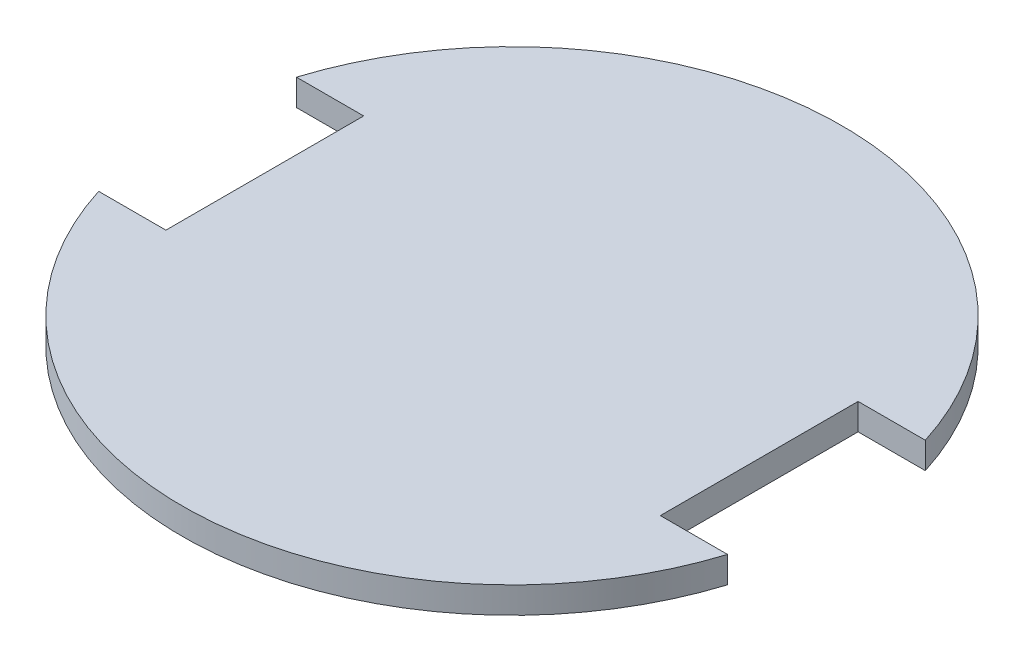
ISO-10303-21;
HEADER;
FILE_DESCRIPTION(('STEP AP214'),'2;1');
FILE_NAME('part.step','',(''),(''),'','','');
FILE_SCHEMA(('AUTOMOTIVE_DESIGN { 1 0 10303 214 1 1 1 1 }'));
ENDSEC;
DATA;
#1=APPLICATION_CONTEXT('core data for automotive mechanical design processes');
#2=APPLICATION_PROTOCOL_DEFINITION('international standard','automotive_design',2000,#1);
#3=PRODUCT_CONTEXT('',#1,'mechanical');
#4=PRODUCT('Part','Part','',(#3));
#5=PRODUCT_RELATED_PRODUCT_CATEGORY('part','',(#4));
#6=PRODUCT_DEFINITION_FORMATION('','',#4);
#7=PRODUCT_DEFINITION_CONTEXT('part definition',#1,'design');
#8=PRODUCT_DEFINITION('design','',#6,#7);
#9=PRODUCT_DEFINITION_SHAPE('','',#8);
#10=(LENGTH_UNIT() NAMED_UNIT(*) SI_UNIT(.MILLI.,.METRE.));
#11=(NAMED_UNIT(*) PLANE_ANGLE_UNIT() SI_UNIT($,.RADIAN.));
#12=(NAMED_UNIT(*) SI_UNIT($,.STERADIAN.) SOLID_ANGLE_UNIT());
#13=UNCERTAINTY_MEASURE_WITH_UNIT(LENGTH_MEASURE(1.E-05),#10,'distance_accuracy_value','');
#14=(GEOMETRIC_REPRESENTATION_CONTEXT(3) GLOBAL_UNCERTAINTY_ASSIGNED_CONTEXT((#13)) GLOBAL_UNIT_ASSIGNED_CONTEXT((#10,
#11,#12)) REPRESENTATION_CONTEXT('',''));
#15=CARTESIAN_POINT('',(0.,0.,0.));
#16=DIRECTION('',(0.,0.,1.));
#17=DIRECTION('',(1.,0.,0.));
#18=AXIS2_PLACEMENT_3D('',#15,#16,#17);
#19=CARTESIAN_POINT('',(-75.,8.,-30.));
#20=DIRECTION('',(0.,0.,-1.));
#21=DIRECTION('',(-1.,0.,0.));
#22=AXIS2_PLACEMENT_3D('',#19,#20,#21);
#23=PLANE('',#22);
#24=DIRECTION('',(1.,0.,0.));
#25=VECTOR('',#24,1.);
#26=CARTESIAN_POINT('',(-75.,0.,-30.));
#27=LINE('',#26,#25);
#28=CARTESIAN_POINT('',(-95.3939201416946,0.,-30.));
#29=VERTEX_POINT('',#28);
#30=CARTESIAN_POINT('',(-75.,0.,-30.));
#31=VERTEX_POINT('',#30);
#32=EDGE_CURVE('E212',#29,#31,#27,.T.);
#33=ORIENTED_EDGE('',*,*,#32,.T.);
#34=DIRECTION('',(0.,-1.,0.));
#35=VECTOR('',#34,1.);
#36=CARTESIAN_POINT('',(-75.,8.,-30.));
#37=LINE('',#36,#35);
#38=CARTESIAN_POINT('',(-75.,8.,-30.));
#39=VERTEX_POINT('',#38);
#40=EDGE_CURVE('E12',#39,#31,#37,.T.);
#41=ORIENTED_EDGE('',*,*,#40,.F.);
#42=DIRECTION('',(1.,0.,0.));
#43=VECTOR('',#42,1.);
#44=CARTESIAN_POINT('',(-75.,8.,-30.));
#45=LINE('',#44,#43);
#46=CARTESIAN_POINT('',(-95.3939201416946,8.,-30.));
#47=VERTEX_POINT('',#46);
#48=EDGE_CURVE('E164',#47,#39,#45,.T.);
#49=ORIENTED_EDGE('',*,*,#48,.F.);
#50=DIRECTION('',(0.,-1.,0.));
#51=VECTOR('',#50,1.);
#52=CARTESIAN_POINT('',(-95.3939201416946,8.,-30.));
#53=LINE('',#52,#51);
#54=EDGE_CURVE('E139',#47,#29,#53,.T.);
#55=ORIENTED_EDGE('',*,*,#54,.T.);
#56=EDGE_LOOP('',(#33,#41,#49,#55));
#57=FACE_BOUND('',#56,.T.);
#58=ADVANCED_FACE('F41',(#57),#23,.F.);
#59=CARTESIAN_POINT('',(-75.,8.,-30.));
#60=DIRECTION('',(1.,0.,0.));
#61=DIRECTION('',(0.,0.,-1.));
#62=AXIS2_PLACEMENT_3D('',#59,#60,#61);
#63=PLANE('',#62);
#64=DIRECTION('',(0.,0.,1.));
#65=VECTOR('',#64,1.);
#66=CARTESIAN_POINT('',(-75.,0.,-30.));
#67=LINE('',#66,#65);
#68=CARTESIAN_POINT('',(-75.,0.,30.));
#69=VERTEX_POINT('',#68);
#70=EDGE_CURVE('E205',#31,#69,#67,.T.);
#71=ORIENTED_EDGE('',*,*,#70,.T.);
#72=DIRECTION('',(0.,-1.,0.));
#73=VECTOR('',#72,1.);
#74=CARTESIAN_POINT('',(-75.,8.,30.));
#75=LINE('',#74,#73);
#76=CARTESIAN_POINT('',(-75.,8.,30.));
#77=VERTEX_POINT('',#76);
#78=EDGE_CURVE('E50',#77,#69,#75,.T.);
#79=ORIENTED_EDGE('',*,*,#78,.F.);
#80=DIRECTION('',(0.,0.,1.));
#81=VECTOR('',#80,1.);
#82=CARTESIAN_POINT('',(-75.,8.,-30.));
#83=LINE('',#82,#81);
#84=EDGE_CURVE('E101',#39,#77,#83,.T.);
#85=ORIENTED_EDGE('',*,*,#84,.F.);
#86=ORIENTED_EDGE('',*,*,#40,.T.);
#87=EDGE_LOOP('',(#71,#79,#85,#86));
#88=FACE_BOUND('',#87,.T.);
#89=ADVANCED_FACE('F238',(#88),#63,.F.);
#90=CARTESIAN_POINT('',(-75.,8.,30.));
#91=DIRECTION('',(0.,0.,1.));
#92=DIRECTION('',(1.,0.,0.));
#93=AXIS2_PLACEMENT_3D('',#90,#91,#92);
#94=PLANE('',#93);
#95=DIRECTION('',(-1.,0.,0.));
#96=VECTOR('',#95,1.);
#97=CARTESIAN_POINT('',(-75.,0.,30.));
#98=LINE('',#97,#96);
#99=CARTESIAN_POINT('',(-95.3939201416946,0.,30.));
#100=VERTEX_POINT('',#99);
#101=EDGE_CURVE('E200',#69,#100,#98,.T.);
#102=ORIENTED_EDGE('',*,*,#101,.T.);
#103=DIRECTION('',(0.,-1.,0.));
#104=VECTOR('',#103,1.);
#105=CARTESIAN_POINT('',(-95.3939201416946,8.,30.));
#106=LINE('',#105,#104);
#107=CARTESIAN_POINT('',(-95.3939201416946,8.,30.));
#108=VERTEX_POINT('',#107);
#109=EDGE_CURVE('E188',#108,#100,#106,.T.);
#110=ORIENTED_EDGE('',*,*,#109,.F.);
#111=DIRECTION('',(-1.,0.,0.));
#112=VECTOR('',#111,1.);
#113=CARTESIAN_POINT('',(-75.,8.,30.));
#114=LINE('',#113,#112);
#115=EDGE_CURVE('E156',#77,#108,#114,.T.);
#116=ORIENTED_EDGE('',*,*,#115,.F.);
#117=ORIENTED_EDGE('',*,*,#78,.T.);
#118=EDGE_LOOP('',(#102,#110,#116,#117));
#119=FACE_BOUND('',#118,.T.);
#120=ADVANCED_FACE('F198',(#119),#94,.F.);
#121=CARTESIAN_POINT('',(0.,8.,0.));
#122=DIRECTION('',(0.,-1.,0.));
#123=DIRECTION('',(0.,0.,-1.));
#124=AXIS2_PLACEMENT_3D('',#121,#122,#123);
#125=CYLINDRICAL_SURFACE('',#124,100.);
#126=CARTESIAN_POINT('',(0.,0.,0.));
#127=DIRECTION('',(0.,1.,0.));
#128=DIRECTION('',(0.,0.,-1.));
#129=AXIS2_PLACEMENT_3D('',#126,#127,#128);
#130=CIRCLE('',#129,100.);
#131=CARTESIAN_POINT('',(95.3939201416946,0.,30.));
#132=VERTEX_POINT('',#131);
#133=EDGE_CURVE('E207',#100,#132,#130,.T.);
#134=ORIENTED_EDGE('',*,*,#133,.T.);
#135=DIRECTION('',(0.,-1.,0.));
#136=VECTOR('',#135,1.);
#137=CARTESIAN_POINT('',(95.3939201416946,8.,30.));
#138=LINE('',#137,#136);
#139=CARTESIAN_POINT('',(95.3939201416946,8.,30.));
#140=VERTEX_POINT('',#139);
#141=EDGE_CURVE('E184',#140,#132,#138,.T.);
#142=ORIENTED_EDGE('',*,*,#141,.F.);
#143=CARTESIAN_POINT('',(0.,8.,0.));
#144=DIRECTION('',(0.,1.,0.));
#145=DIRECTION('',(0.,0.,-1.));
#146=AXIS2_PLACEMENT_3D('',#143,#144,#145);
#147=CIRCLE('',#146,100.);
#148=EDGE_CURVE('E152',#108,#140,#147,.T.);
#149=ORIENTED_EDGE('',*,*,#148,.F.);
#150=ORIENTED_EDGE('',*,*,#109,.T.);
#151=EDGE_LOOP('',(#134,#142,#149,#150));
#152=FACE_BOUND('',#151,.T.);
#153=ADVANCED_FACE('F230',(#152),#125,.T.);
#154=CARTESIAN_POINT('',(75.,8.,30.));
#155=DIRECTION('',(0.,0.,1.));
#156=DIRECTION('',(1.,0.,0.));
#157=AXIS2_PLACEMENT_3D('',#154,#155,#156);
#158=PLANE('',#157);
#159=DIRECTION('',(-1.,0.,0.));
#160=VECTOR('',#159,1.);
#161=CARTESIAN_POINT('',(75.,0.,30.));
#162=LINE('',#161,#160);
#163=CARTESIAN_POINT('',(75.,0.,30.));
#164=VERTEX_POINT('',#163);
#165=EDGE_CURVE('E209',#132,#164,#162,.T.);
#166=ORIENTED_EDGE('',*,*,#165,.T.);
#167=DIRECTION('',(0.,-1.,0.));
#168=VECTOR('',#167,1.);
#169=CARTESIAN_POINT('',(75.,8.,30.));
#170=LINE('',#169,#168);
#171=CARTESIAN_POINT('',(75.,8.,30.));
#172=VERTEX_POINT('',#171);
#173=EDGE_CURVE('E131',#172,#164,#170,.T.);
#174=ORIENTED_EDGE('',*,*,#173,.F.);
#175=DIRECTION('',(-1.,0.,0.));
#176=VECTOR('',#175,1.);
#177=CARTESIAN_POINT('',(75.,8.,30.));
#178=LINE('',#177,#176);
#179=EDGE_CURVE('E120',#140,#172,#178,.T.);
#180=ORIENTED_EDGE('',*,*,#179,.F.);
#181=ORIENTED_EDGE('',*,*,#141,.T.);
#182=EDGE_LOOP('',(#166,#174,#180,#181));
#183=FACE_BOUND('',#182,.T.);
#184=ADVANCED_FACE('F226',(#183),#158,.F.);
#185=CARTESIAN_POINT('',(75.,8.,-30.));
#186=DIRECTION('',(-1.,0.,0.));
#187=DIRECTION('',(0.,0.,1.));
#188=AXIS2_PLACEMENT_3D('',#185,#186,#187);
#189=PLANE('',#188);
#190=DIRECTION('',(0.,0.,-1.));
#191=VECTOR('',#190,1.);
#192=CARTESIAN_POINT('',(75.,0.,-30.));
#193=LINE('',#192,#191);
#194=CARTESIAN_POINT('',(75.,0.,-30.));
#195=VERTEX_POINT('',#194);
#196=EDGE_CURVE('E129',#164,#195,#193,.T.);
#197=ORIENTED_EDGE('',*,*,#196,.T.);
#198=DIRECTION('',(0.,-1.,0.));
#199=VECTOR('',#198,1.);
#200=CARTESIAN_POINT('',(75.,8.,-30.));
#201=LINE('',#200,#199);
#202=CARTESIAN_POINT('',(75.,8.,-30.));
#203=VERTEX_POINT('',#202);
#204=EDGE_CURVE('E126',#203,#195,#201,.T.);
#205=ORIENTED_EDGE('',*,*,#204,.F.);
#206=DIRECTION('',(0.,0.,-1.));
#207=VECTOR('',#206,1.);
#208=CARTESIAN_POINT('',(75.,8.,-30.));
#209=LINE('',#208,#207);
#210=EDGE_CURVE('E114',#172,#203,#209,.T.);
#211=ORIENTED_EDGE('',*,*,#210,.F.);
#212=ORIENTED_EDGE('',*,*,#173,.T.);
#213=EDGE_LOOP('',(#197,#205,#211,#212));
#214=FACE_BOUND('',#213,.T.);
#215=ADVANCED_FACE('F127',(#214),#189,.F.);
#216=CARTESIAN_POINT('',(75.,8.,-30.));
#217=DIRECTION('',(0.,0.,-1.));
#218=DIRECTION('',(-1.,0.,0.));
#219=AXIS2_PLACEMENT_3D('',#216,#217,#218);
#220=PLANE('',#219);
#221=DIRECTION('',(1.,0.,0.));
#222=VECTOR('',#221,1.);
#223=CARTESIAN_POINT('',(75.,0.,-30.));
#224=LINE('',#223,#222);
#225=CARTESIAN_POINT('',(95.3939201416946,0.,-30.));
#226=VERTEX_POINT('',#225);
#227=EDGE_CURVE('E87',#195,#226,#224,.T.);
#228=ORIENTED_EDGE('',*,*,#227,.T.);
#229=DIRECTION('',(0.,-1.,0.));
#230=VECTOR('',#229,1.);
#231=CARTESIAN_POINT('',(95.3939201416946,8.,-30.));
#232=LINE('',#231,#230);
#233=CARTESIAN_POINT('',(95.3939201416946,8.,-30.));
#234=VERTEX_POINT('',#233);
#235=EDGE_CURVE('E132',#234,#226,#232,.T.);
#236=ORIENTED_EDGE('',*,*,#235,.F.);
#237=DIRECTION('',(1.,0.,0.));
#238=VECTOR('',#237,1.);
#239=CARTESIAN_POINT('',(75.,8.,-30.));
#240=LINE('',#239,#238);
#241=EDGE_CURVE('E118',#203,#234,#240,.T.);
#242=ORIENTED_EDGE('',*,*,#241,.F.);
#243=ORIENTED_EDGE('',*,*,#204,.T.);
#244=EDGE_LOOP('',(#228,#236,#242,#243));
#245=FACE_BOUND('',#244,.T.);
#246=ADVANCED_FACE('F134',(#245),#220,.F.);
#247=CARTESIAN_POINT('',(0.,8.,0.));
#248=DIRECTION('',(0.,-1.,0.));
#249=DIRECTION('',(0.,0.,-1.));
#250=AXIS2_PLACEMENT_3D('',#247,#248,#249);
#251=CYLINDRICAL_SURFACE('',#250,100.);
#252=CARTESIAN_POINT('',(0.,0.,0.));
#253=DIRECTION('',(0.,1.,0.));
#254=DIRECTION('',(0.,0.,-1.));
#255=AXIS2_PLACEMENT_3D('',#252,#253,#254);
#256=CIRCLE('',#255,100.);
#257=EDGE_CURVE('E93',#226,#29,#256,.T.);
#258=ORIENTED_EDGE('',*,*,#257,.T.);
#259=ORIENTED_EDGE('',*,*,#54,.F.);
#260=CARTESIAN_POINT('',(0.,8.,0.));
#261=DIRECTION('',(0.,1.,0.));
#262=DIRECTION('',(0.,0.,-1.));
#263=AXIS2_PLACEMENT_3D('',#260,#261,#262);
#264=CIRCLE('',#263,100.);
#265=EDGE_CURVE('E58',#234,#47,#264,.T.);
#266=ORIENTED_EDGE('',*,*,#265,.F.);
#267=ORIENTED_EDGE('',*,*,#235,.T.);
#268=EDGE_LOOP('',(#258,#259,#266,#267));
#269=FACE_BOUND('',#268,.T.);
#270=ADVANCED_FACE('F271',(#269),#251,.T.);
#271=CARTESIAN_POINT('',(0.,8.,0.));
#272=DIRECTION('',(0.,-1.,0.));
#273=DIRECTION('',(0.,0.,-1.));
#274=AXIS2_PLACEMENT_3D('',#271,#272,#273);
#275=PLANE('',#274);
#276=ORIENTED_EDGE('',*,*,#48,.T.);
#277=ORIENTED_EDGE('',*,*,#84,.T.);
#278=ORIENTED_EDGE('',*,*,#115,.T.);
#279=ORIENTED_EDGE('',*,*,#148,.T.);
#280=ORIENTED_EDGE('',*,*,#179,.T.);
#281=ORIENTED_EDGE('',*,*,#210,.T.);
#282=ORIENTED_EDGE('',*,*,#241,.T.);
#283=ORIENTED_EDGE('',*,*,#265,.T.);
#284=EDGE_LOOP('',(#276,#277,#278,#279,#280,#281,#282,#283));
#285=FACE_BOUND('',#284,.T.);
#286=ADVANCED_FACE('F116',(#285),#275,.F.);
#287=CARTESIAN_POINT('',(0.,0.,0.));
#288=DIRECTION('',(0.,-1.,0.));
#289=DIRECTION('',(0.,0.,-1.));
#290=AXIS2_PLACEMENT_3D('',#287,#288,#289);
#291=PLANE('',#290);
#292=ORIENTED_EDGE('',*,*,#32,.F.);
#293=ORIENTED_EDGE('',*,*,#257,.F.);
#294=ORIENTED_EDGE('',*,*,#227,.F.);
#295=ORIENTED_EDGE('',*,*,#196,.F.);
#296=ORIENTED_EDGE('',*,*,#165,.F.);
#297=ORIENTED_EDGE('',*,*,#133,.F.);
#298=ORIENTED_EDGE('',*,*,#101,.F.);
#299=ORIENTED_EDGE('',*,*,#70,.F.);
#300=EDGE_LOOP('',(#292,#293,#294,#295,#296,#297,#298,#299));
#301=FACE_BOUND('',#300,.T.);
#302=ADVANCED_FACE('F204',(#301),#291,.T.);
#303=CLOSED_SHELL('',(#58,#89,#120,#153,#184,#215,#246,#270,#286,#302));
#304=MANIFOLD_SOLID_BREP('B2',#303);
#305=ADVANCED_BREP_SHAPE_REPRESENTATION('',(#18,#304),#14);
#306=SHAPE_DEFINITION_REPRESENTATION(#9,#305);
ENDSEC;
END-ISO-10303-21;
